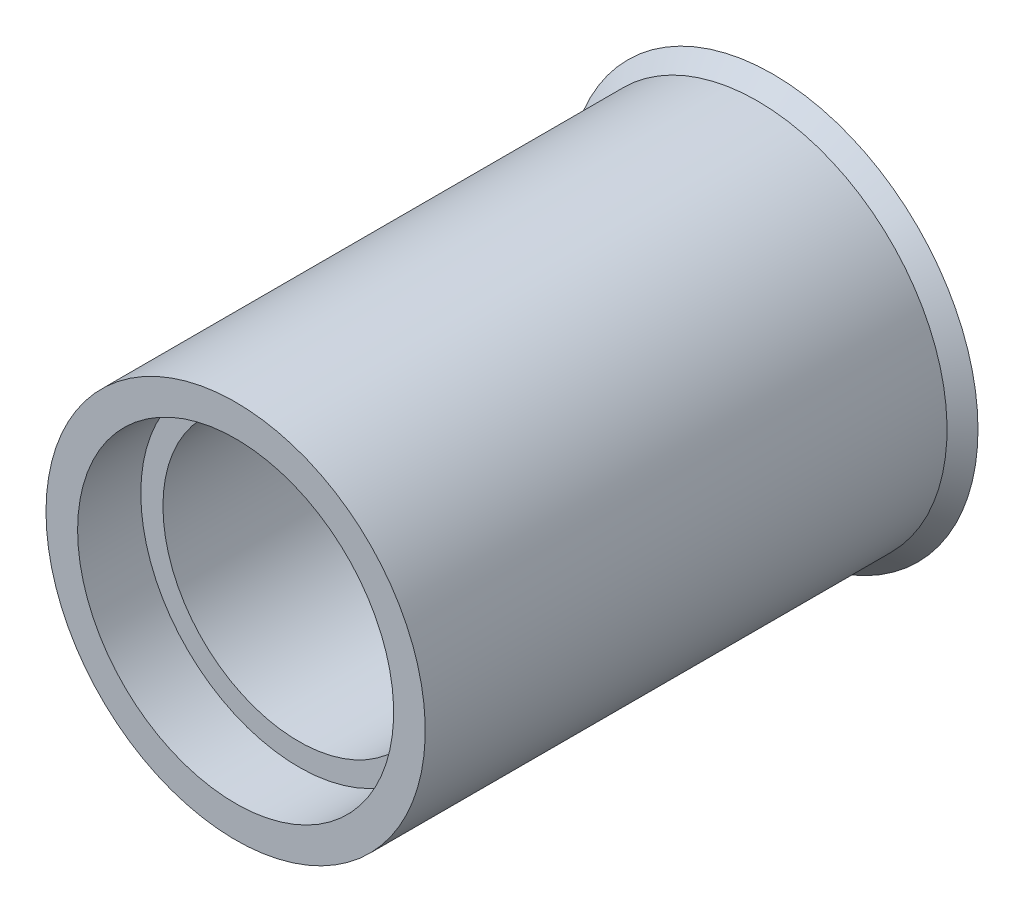
ISO-10303-21;
HEADER;
FILE_DESCRIPTION(('STEP AP214'),'2;1');
FILE_NAME('part.step','',(''),(''),'','','');
FILE_SCHEMA(('AUTOMOTIVE_DESIGN { 1 0 10303 214 1 1 1 1 }'));
ENDSEC;
DATA;
#1=APPLICATION_CONTEXT('core data for automotive mechanical design processes');
#2=APPLICATION_PROTOCOL_DEFINITION('international standard','automotive_design',2000,#1);
#3=PRODUCT_CONTEXT('',#1,'mechanical');
#4=PRODUCT('Part','Part','',(#3));
#5=PRODUCT_RELATED_PRODUCT_CATEGORY('part','',(#4));
#6=PRODUCT_DEFINITION_FORMATION('','',#4);
#7=PRODUCT_DEFINITION_CONTEXT('part definition',#1,'design');
#8=PRODUCT_DEFINITION('design','',#6,#7);
#9=PRODUCT_DEFINITION_SHAPE('','',#8);
#10=(LENGTH_UNIT() NAMED_UNIT(*) SI_UNIT(.MILLI.,.METRE.));
#11=(NAMED_UNIT(*) PLANE_ANGLE_UNIT() SI_UNIT($,.RADIAN.));
#12=(NAMED_UNIT(*) SI_UNIT($,.STERADIAN.) SOLID_ANGLE_UNIT());
#13=UNCERTAINTY_MEASURE_WITH_UNIT(LENGTH_MEASURE(1.E-05),#10,'distance_accuracy_value','');
#14=(GEOMETRIC_REPRESENTATION_CONTEXT(3) GLOBAL_UNCERTAINTY_ASSIGNED_CONTEXT((#13)) GLOBAL_UNIT_ASSIGNED_CONTEXT((#10,
#11,#12)) REPRESENTATION_CONTEXT('',''));
#15=CARTESIAN_POINT('',(0.,0.,0.));
#16=DIRECTION('',(0.,0.,1.));
#17=DIRECTION('',(1.,0.,0.));
#18=AXIS2_PLACEMENT_3D('',#15,#16,#17);
#19=CARTESIAN_POINT('',(0.,0.,0.));
#20=DIRECTION('',(0.,0.,1.));
#21=DIRECTION('',(1.,0.,0.));
#22=AXIS2_PLACEMENT_3D('',#19,#20,#21);
#23=PLANE('',#22);
#24=CARTESIAN_POINT('',(0.,0.,0.));
#25=DIRECTION('',(0.,0.,-1.));
#26=DIRECTION('',(1.,0.,0.));
#27=AXIS2_PLACEMENT_3D('',#24,#25,#26);
#28=CIRCLE('',#27,4.3);
#29=CARTESIAN_POINT('',(-4.3,0.,0.));
#30=VERTEX_POINT('',#29);
#31=EDGE_CURVE('E91',#30,#30,#28,.T.);
#32=ORIENTED_EDGE('',*,*,#31,.F.);
#33=EDGE_LOOP('',(#32));
#34=FACE_BOUND('',#33,.T.);
#35=CARTESIAN_POINT('',(0.,0.,0.));
#36=DIRECTION('',(0.,0.,1.));
#37=DIRECTION('',(1.,0.,0.));
#38=AXIS2_PLACEMENT_3D('',#35,#36,#37);
#39=CIRCLE('',#38,6.49);
#40=CARTESIAN_POINT('',(0.,6.49,0.));
#41=VERTEX_POINT('',#40);
#42=EDGE_CURVE('E90',#41,#41,#39,.T.);
#43=ORIENTED_EDGE('',*,*,#42,.F.);
#44=EDGE_LOOP('',(#43));
#45=FACE_BOUND('',#44,.T.);
#46=ADVANCED_FACE('F17',(#34,#45),#23,.F.);
#47=CARTESIAN_POINT('',(0.,0.,17.));
#48=DIRECTION('',(0.,0.,1.));
#49=DIRECTION('',(1.,0.,0.));
#50=AXIS2_PLACEMENT_3D('',#47,#48,#49);
#51=PLANE('',#50);
#52=CARTESIAN_POINT('',(0.,0.,17.));
#53=DIRECTION('',(0.,0.,-1.));
#54=DIRECTION('',(1.,0.,0.));
#55=AXIS2_PLACEMENT_3D('',#52,#53,#54);
#56=CIRCLE('',#55,5.);
#57=CARTESIAN_POINT('',(-5.,0.,17.));
#58=VERTEX_POINT('',#57);
#59=EDGE_CURVE('E106',#58,#58,#56,.T.);
#60=ORIENTED_EDGE('',*,*,#59,.T.);
#61=EDGE_LOOP('',(#60));
#62=FACE_BOUND('',#61,.T.);
#63=CARTESIAN_POINT('',(0.,0.,17.));
#64=DIRECTION('',(0.,0.,1.));
#65=DIRECTION('',(1.,0.,0.));
#66=AXIS2_PLACEMENT_3D('',#63,#64,#65);
#67=CIRCLE('',#66,6.);
#68=CARTESIAN_POINT('',(-6.,0.,17.));
#69=VERTEX_POINT('',#68);
#70=EDGE_CURVE('E20',#69,#69,#67,.T.);
#71=ORIENTED_EDGE('',*,*,#70,.T.);
#72=EDGE_LOOP('',(#71));
#73=FACE_BOUND('',#72,.T.);
#74=ADVANCED_FACE('F116',(#62,#73),#51,.T.);
#75=CARTESIAN_POINT('',(0.,0.,0.));
#76=DIRECTION('',(0.,0.,1.));
#77=DIRECTION('',(1.,0.,0.));
#78=AXIS2_PLACEMENT_3D('',#75,#76,#77);
#79=CYLINDRICAL_SURFACE('',#78,6.);
#80=ORIENTED_EDGE('',*,*,#70,.F.);
#81=DIRECTION('',(0.,0.,-1.));
#82=VECTOR('',#81,1.);
#83=CARTESIAN_POINT('',(-6.,0.,0.));
#84=LINE('',#83,#82);
#85=CARTESIAN_POINT('',(-6.,0.,0.49));
#86=VERTEX_POINT('',#85);
#87=EDGE_CURVE('E11',#69,#86,#84,.T.);
#88=ORIENTED_EDGE('',*,*,#87,.T.);
#89=CARTESIAN_POINT('',(0.,0.,0.49));
#90=DIRECTION('',(0.,0.,1.));
#91=DIRECTION('',(1.,0.,0.));
#92=AXIS2_PLACEMENT_3D('',#89,#90,#91);
#93=CIRCLE('',#92,6.);
#94=CARTESIAN_POINT('',(0.,6.,0.49));
#95=VERTEX_POINT('',#94);
#96=EDGE_CURVE('E71',#86,#95,#93,.T.);
#97=ORIENTED_EDGE('',*,*,#96,.T.);
#98=CARTESIAN_POINT('',(0.,0.,0.49));
#99=DIRECTION('',(0.,0.,1.));
#100=DIRECTION('',(1.,0.,0.));
#101=AXIS2_PLACEMENT_3D('',#98,#99,#100);
#102=CIRCLE('',#101,6.);
#103=EDGE_CURVE('E72',#95,#86,#102,.T.);
#104=ORIENTED_EDGE('',*,*,#103,.T.);
#105=ORIENTED_EDGE('',*,*,#87,.F.);
#106=EDGE_LOOP('',(#80,#88,#97,#104,#105));
#107=FACE_BOUND('',#106,.T.);
#108=ADVANCED_FACE('F69',(#107),#79,.T.);
#109=CARTESIAN_POINT('',(0.,0.,0.));
#110=DIRECTION('',(0.,0.,1.));
#111=DIRECTION('',(1.,0.,0.));
#112=AXIS2_PLACEMENT_3D('',#109,#110,#111);
#113=CYLINDRICAL_SURFACE('',#112,5.);
#114=ORIENTED_EDGE('',*,*,#59,.F.);
#115=DIRECTION('',(0.,0.,-1.));
#116=VECTOR('',#115,1.);
#117=CARTESIAN_POINT('',(-5.,0.,0.));
#118=LINE('',#117,#116);
#119=CARTESIAN_POINT('',(-5.,0.,15.));
#120=VERTEX_POINT('',#119);
#121=EDGE_CURVE('E44',#58,#120,#118,.T.);
#122=ORIENTED_EDGE('',*,*,#121,.T.);
#123=CARTESIAN_POINT('',(0.,0.,15.));
#124=DIRECTION('',(0.,0.,-1.));
#125=DIRECTION('',(1.,0.,0.));
#126=AXIS2_PLACEMENT_3D('',#123,#124,#125);
#127=CIRCLE('',#126,5.);
#128=EDGE_CURVE('E96',#120,#120,#127,.T.);
#129=ORIENTED_EDGE('',*,*,#128,.T.);
#130=ORIENTED_EDGE('',*,*,#121,.F.);
#131=EDGE_LOOP('',(#114,#122,#129,#130));
#132=FACE_BOUND('',#131,.T.);
#133=ADVANCED_FACE('F124',(#132),#113,.F.);
#134=CARTESIAN_POINT('',(0.,0.,15.));
#135=DIRECTION('',(0.,0.,1.));
#136=DIRECTION('',(1.,0.,0.));
#137=AXIS2_PLACEMENT_3D('',#134,#135,#136);
#138=PLANE('',#137);
#139=CARTESIAN_POINT('',(0.,0.,15.));
#140=DIRECTION('',(0.,0.,-1.));
#141=DIRECTION('',(1.,0.,0.));
#142=AXIS2_PLACEMENT_3D('',#139,#140,#141);
#143=CIRCLE('',#142,4.3);
#144=CARTESIAN_POINT('',(-4.3,0.,15.));
#145=VERTEX_POINT('',#144);
#146=EDGE_CURVE('E95',#145,#145,#143,.T.);
#147=ORIENTED_EDGE('',*,*,#146,.T.);
#148=EDGE_LOOP('',(#147));
#149=FACE_BOUND('',#148,.T.);
#150=ORIENTED_EDGE('',*,*,#128,.F.);
#151=EDGE_LOOP('',(#150));
#152=FACE_BOUND('',#151,.T.);
#153=ADVANCED_FACE('F131',(#149,#152),#138,.T.);
#154=CARTESIAN_POINT('',(0.,0.,0.));
#155=DIRECTION('',(0.,0.,1.));
#156=DIRECTION('',(1.,0.,0.));
#157=AXIS2_PLACEMENT_3D('',#154,#155,#156);
#158=CYLINDRICAL_SURFACE('',#157,4.3);
#159=ORIENTED_EDGE('',*,*,#146,.F.);
#160=DIRECTION('',(0.,0.,-1.));
#161=VECTOR('',#160,1.);
#162=CARTESIAN_POINT('',(-4.3,0.,0.));
#163=LINE('',#162,#161);
#164=EDGE_CURVE('E100',#145,#30,#163,.T.);
#165=ORIENTED_EDGE('',*,*,#164,.T.);
#166=ORIENTED_EDGE('',*,*,#31,.T.);
#167=ORIENTED_EDGE('',*,*,#164,.F.);
#168=EDGE_LOOP('',(#159,#165,#166,#167));
#169=FACE_BOUND('',#168,.T.);
#170=ADVANCED_FACE('F135',(#169),#158,.F.);
#171=CARTESIAN_POINT('',(0.,0.,0.25));
#172=DIRECTION('',(0.,0.,-1.));
#173=DIRECTION('',(0.,-1.,0.));
#174=AXIS2_PLACEMENT_3D('',#171,#172,#173);
#175=CONICAL_SURFACE('',#174,6.24,0.785398163397448);
#176=ORIENTED_EDGE('',*,*,#96,.F.);
#177=ORIENTED_EDGE('',*,*,#103,.F.);
#178=DIRECTION('',(0.,0.707106781186547,-0.707106781186548));
#179=VECTOR('',#178,1.);
#180=CARTESIAN_POINT('',(0.,6.24,0.25));
#181=LINE('',#180,#179);
#182=EDGE_CURVE('E77',#95,#41,#181,.T.);
#183=ORIENTED_EDGE('',*,*,#182,.T.);
#184=ORIENTED_EDGE('',*,*,#42,.T.);
#185=ORIENTED_EDGE('',*,*,#182,.F.);
#186=EDGE_LOOP('',(#176,#177,#183,#184,#185));
#187=FACE_BOUND('',#186,.T.);
#188=ADVANCED_FACE('F79',(#187),#175,.T.);
#189=CLOSED_SHELL('',(#46,#74,#108,#133,#153,#170,#188));
#190=MANIFOLD_SOLID_BREP('B1',#189);
#191=ADVANCED_BREP_SHAPE_REPRESENTATION('',(#18,#190),#14);
#192=SHAPE_DEFINITION_REPRESENTATION(#9,#191);
ENDSEC;
END-ISO-10303-21;
